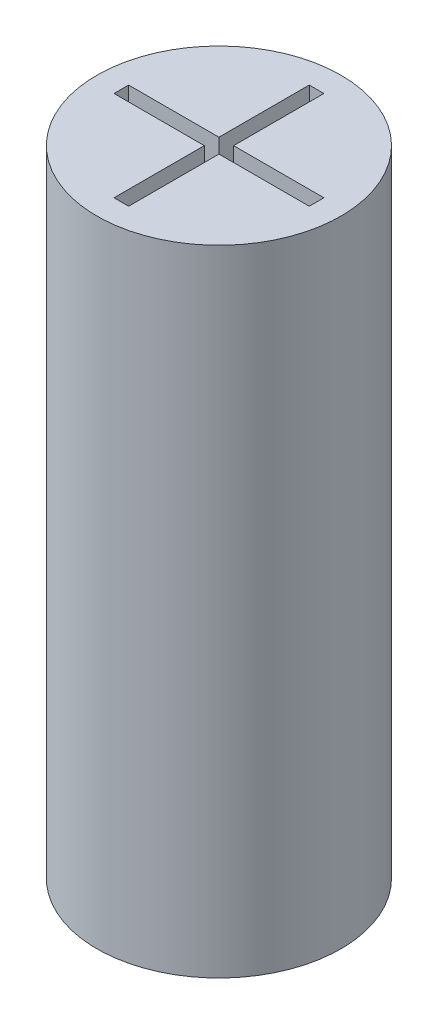
ISO-10303-21;
HEADER;
FILE_DESCRIPTION(('STEP AP214'),'2;1');
FILE_NAME('part.step','',(''),(''),'','','');
FILE_SCHEMA(('AUTOMOTIVE_DESIGN { 1 0 10303 214 1 1 1 1 }'));
ENDSEC;
DATA;
#1=APPLICATION_CONTEXT('core data for automotive mechanical design processes');
#2=APPLICATION_PROTOCOL_DEFINITION('international standard','automotive_design',2000,#1);
#3=PRODUCT_CONTEXT('',#1,'mechanical');
#4=PRODUCT('Part','Part','',(#3));
#5=PRODUCT_RELATED_PRODUCT_CATEGORY('part','',(#4));
#6=PRODUCT_DEFINITION_FORMATION('','',#4);
#7=PRODUCT_DEFINITION_CONTEXT('part definition',#1,'design');
#8=PRODUCT_DEFINITION('design','',#6,#7);
#9=PRODUCT_DEFINITION_SHAPE('','',#8);
#10=(LENGTH_UNIT() NAMED_UNIT(*) SI_UNIT(.MILLI.,.METRE.));
#11=(NAMED_UNIT(*) PLANE_ANGLE_UNIT() SI_UNIT($,.RADIAN.));
#12=(NAMED_UNIT(*) SI_UNIT($,.STERADIAN.) SOLID_ANGLE_UNIT());
#13=UNCERTAINTY_MEASURE_WITH_UNIT(LENGTH_MEASURE(1.E-05),#10,'distance_accuracy_value','');
#14=(GEOMETRIC_REPRESENTATION_CONTEXT(3) GLOBAL_UNCERTAINTY_ASSIGNED_CONTEXT((#13)) GLOBAL_UNIT_ASSIGNED_CONTEXT((#10,
#11,#12)) REPRESENTATION_CONTEXT('',''));
#15=CARTESIAN_POINT('',(0.,0.,0.));
#16=DIRECTION('',(0.,0.,1.));
#17=DIRECTION('',(1.,0.,0.));
#18=AXIS2_PLACEMENT_3D('',#15,#16,#17);
#19=CARTESIAN_POINT('',(0.,13.,0.));
#20=DIRECTION('',(0.,1.,0.));
#21=DIRECTION('',(0.,0.,1.));
#22=AXIS2_PLACEMENT_3D('',#19,#20,#21);
#23=PLANE('',#22);
#24=CARTESIAN_POINT('',(0.,13.,0.));
#25=DIRECTION('',(0.,1.,0.));
#26=DIRECTION('',(0.,0.,1.));
#27=AXIS2_PLACEMENT_3D('',#24,#25,#26);
#28=CIRCLE('',#27,2.5);
#29=CARTESIAN_POINT('',(0.,13.,-2.5));
#30=VERTEX_POINT('',#29);
#31=EDGE_CURVE('E11',#30,#30,#28,.T.);
#32=ORIENTED_EDGE('',*,*,#31,.T.);
#33=EDGE_LOOP('',(#32));
#34=FACE_BOUND('',#33,.T.);
#35=DIRECTION('',(1.,0.,0.));
#36=VECTOR('',#35,1.);
#37=CARTESIAN_POINT('',(0.,13.,-0.149999999999999));
#38=LINE('',#37,#36);
#39=CARTESIAN_POINT('',(0.15,13.,-0.149999999999999));
#40=VERTEX_POINT('',#39);
#41=CARTESIAN_POINT('',(2.,13.,-0.149999999999999));
#42=VERTEX_POINT('',#41);
#43=EDGE_CURVE('E181',#40,#42,#38,.T.);
#44=ORIENTED_EDGE('',*,*,#43,.T.);
#45=DIRECTION('',(0.,0.,1.));
#46=VECTOR('',#45,1.);
#47=CARTESIAN_POINT('',(2.,13.,0.));
#48=LINE('',#47,#46);
#49=CARTESIAN_POINT('',(2.,13.,0.150000000000001));
#50=VERTEX_POINT('',#49);
#51=EDGE_CURVE('E61',#42,#50,#48,.T.);
#52=ORIENTED_EDGE('',*,*,#51,.T.);
#53=DIRECTION('',(1.,0.,0.));
#54=VECTOR('',#53,1.);
#55=CARTESIAN_POINT('',(0.,13.,0.150000000000001));
#56=LINE('',#55,#54);
#57=CARTESIAN_POINT('',(0.15,13.,0.150000000000001));
#58=VERTEX_POINT('',#57);
#59=EDGE_CURVE('E218',#58,#50,#56,.T.);
#60=ORIENTED_EDGE('',*,*,#59,.F.);
#61=DIRECTION('',(0.,0.,1.));
#62=VECTOR('',#61,1.);
#63=CARTESIAN_POINT('',(0.15,13.,0.));
#64=LINE('',#63,#62);
#65=CARTESIAN_POINT('',(0.15,13.,2.));
#66=VERTEX_POINT('',#65);
#67=EDGE_CURVE('E215',#58,#66,#64,.T.);
#68=ORIENTED_EDGE('',*,*,#67,.T.);
#69=DIRECTION('',(-1.,0.,0.));
#70=VECTOR('',#69,1.);
#71=CARTESIAN_POINT('',(0.,13.,2.));
#72=LINE('',#71,#70);
#73=CARTESIAN_POINT('',(-0.15,13.,2.));
#74=VERTEX_POINT('',#73);
#75=EDGE_CURVE('E159',#66,#74,#72,.T.);
#76=ORIENTED_EDGE('',*,*,#75,.T.);
#77=DIRECTION('',(0.,0.,1.));
#78=VECTOR('',#77,1.);
#79=CARTESIAN_POINT('',(-0.15,13.,0.));
#80=LINE('',#79,#78);
#81=CARTESIAN_POINT('',(-0.15,13.,0.150000000000001));
#82=VERTEX_POINT('',#81);
#83=EDGE_CURVE('E209',#82,#74,#80,.T.);
#84=ORIENTED_EDGE('',*,*,#83,.F.);
#85=DIRECTION('',(1.,0.,0.));
#86=VECTOR('',#85,1.);
#87=CARTESIAN_POINT('',(0.,13.,0.150000000000001));
#88=LINE('',#87,#86);
#89=CARTESIAN_POINT('',(-2.,13.,0.150000000000001));
#90=VERTEX_POINT('',#89);
#91=EDGE_CURVE('E205',#90,#82,#88,.T.);
#92=ORIENTED_EDGE('',*,*,#91,.F.);
#93=DIRECTION('',(0.,0.,1.));
#94=VECTOR('',#93,1.);
#95=CARTESIAN_POINT('',(-2.,13.,0.));
#96=LINE('',#95,#94);
#97=CARTESIAN_POINT('',(-2.,13.,-0.149999999999999));
#98=VERTEX_POINT('',#97);
#99=EDGE_CURVE('E201',#98,#90,#96,.T.);
#100=ORIENTED_EDGE('',*,*,#99,.F.);
#101=DIRECTION('',(1.,0.,0.));
#102=VECTOR('',#101,1.);
#103=CARTESIAN_POINT('',(0.,13.,-0.149999999999999));
#104=LINE('',#103,#102);
#105=CARTESIAN_POINT('',(-0.15,13.,-0.149999999999999));
#106=VERTEX_POINT('',#105);
#107=EDGE_CURVE('E197',#98,#106,#104,.T.);
#108=ORIENTED_EDGE('',*,*,#107,.T.);
#109=DIRECTION('',(0.,0.,1.));
#110=VECTOR('',#109,1.);
#111=CARTESIAN_POINT('',(-0.15,13.,0.));
#112=LINE('',#111,#110);
#113=CARTESIAN_POINT('',(-0.15,13.,-2.));
#114=VERTEX_POINT('',#113);
#115=EDGE_CURVE('E193',#114,#106,#112,.T.);
#116=ORIENTED_EDGE('',*,*,#115,.F.);
#117=DIRECTION('',(-1.,0.,0.));
#118=VECTOR('',#117,1.);
#119=CARTESIAN_POINT('',(0.,13.,-2.));
#120=LINE('',#119,#118);
#121=CARTESIAN_POINT('',(0.15,13.,-2.));
#122=VERTEX_POINT('',#121);
#123=EDGE_CURVE('E189',#122,#114,#120,.T.);
#124=ORIENTED_EDGE('',*,*,#123,.F.);
#125=DIRECTION('',(0.,0.,1.));
#126=VECTOR('',#125,1.);
#127=CARTESIAN_POINT('',(0.15,13.,0.));
#128=LINE('',#127,#126);
#129=EDGE_CURVE('E185',#122,#40,#128,.T.);
#130=ORIENTED_EDGE('',*,*,#129,.T.);
#131=EDGE_LOOP('',(#44,#52,#60,#68,#76,#84,#92,#100,#108,#116,#124,#130));
#132=FACE_BOUND('',#131,.T.);
#133=ADVANCED_FACE('F45',(#34,#132),#23,.T.);
#134=CARTESIAN_POINT('',(0.,13.,0.));
#135=DIRECTION('',(0.,-1.,0.));
#136=DIRECTION('',(0.,0.,-1.));
#137=AXIS2_PLACEMENT_3D('',#134,#135,#136);
#138=CYLINDRICAL_SURFACE('',#137,2.5);
#139=CARTESIAN_POINT('',(0.,0.,0.));
#140=DIRECTION('',(0.,1.,0.));
#141=DIRECTION('',(0.,0.,1.));
#142=AXIS2_PLACEMENT_3D('',#139,#140,#141);
#143=CIRCLE('',#142,2.5);
#144=CARTESIAN_POINT('',(0.,0.,-2.5));
#145=VERTEX_POINT('',#144);
#146=EDGE_CURVE('E49',#145,#145,#143,.T.);
#147=CARTESIAN_POINT('',(0.,13.,-2.5));
#148=CARTESIAN_POINT('',(0.,12.8645833333333,-2.5));
#149=CARTESIAN_POINT('',(0.,12.7291666666667,-2.5));
#150=CARTESIAN_POINT('',(0.,12.4583333333333,-2.5));
#151=CARTESIAN_POINT('',(0.,12.3229166666667,-2.5));
#152=CARTESIAN_POINT('',(0.,12.0520833333333,-2.5));
#153=CARTESIAN_POINT('',(0.,11.9166666666667,-2.5));
#154=CARTESIAN_POINT('',(0.,11.6458333333333,-2.5));
#155=CARTESIAN_POINT('',(0.,11.5104166666667,-2.5));
#156=CARTESIAN_POINT('',(0.,11.2395833333333,-2.5));
#157=CARTESIAN_POINT('',(0.,11.1041666666667,-2.5));
#158=CARTESIAN_POINT('',(0.,10.8333333333333,-2.5));
#159=CARTESIAN_POINT('',(0.,10.6979166666667,-2.5));
#160=CARTESIAN_POINT('',(0.,10.4270833333333,-2.5));
#161=CARTESIAN_POINT('',(0.,10.2916666666667,-2.5));
#162=CARTESIAN_POINT('',(0.,10.0208333333333,-2.5));
#163=CARTESIAN_POINT('',(0.,9.88541666666667,-2.5));
#164=CARTESIAN_POINT('',(0.,9.61458333333333,-2.5));
#165=CARTESIAN_POINT('',(0.,9.47916666666667,-2.5));
#166=CARTESIAN_POINT('',(0.,9.20833333333333,-2.5));
#167=CARTESIAN_POINT('',(0.,9.07291666666667,-2.5));
#168=CARTESIAN_POINT('',(0.,8.80208333333333,-2.5));
#169=CARTESIAN_POINT('',(0.,8.66666666666667,-2.5));
#170=CARTESIAN_POINT('',(0.,8.39583333333333,-2.5));
#171=CARTESIAN_POINT('',(0.,8.26041666666667,-2.5));
#172=CARTESIAN_POINT('',(0.,7.98958333333333,-2.5));
#173=CARTESIAN_POINT('',(0.,7.85416666666667,-2.5));
#174=CARTESIAN_POINT('',(0.,7.58333333333333,-2.5));
#175=CARTESIAN_POINT('',(0.,7.44791666666667,-2.5));
#176=CARTESIAN_POINT('',(0.,7.17708333333333,-2.5));
#177=CARTESIAN_POINT('',(0.,7.04166666666667,-2.5));
#178=CARTESIAN_POINT('',(0.,6.77083333333333,-2.5));
#179=CARTESIAN_POINT('',(0.,6.63541666666667,-2.5));
#180=CARTESIAN_POINT('',(0.,6.36458333333333,-2.5));
#181=CARTESIAN_POINT('',(0.,6.22916666666667,-2.5));
#182=CARTESIAN_POINT('',(0.,5.95833333333333,-2.5));
#183=CARTESIAN_POINT('',(0.,5.82291666666667,-2.5));
#184=CARTESIAN_POINT('',(0.,5.55208333333333,-2.5));
#185=CARTESIAN_POINT('',(0.,5.41666666666667,-2.5));
#186=CARTESIAN_POINT('',(0.,5.14583333333333,-2.5));
#187=CARTESIAN_POINT('',(0.,5.01041666666667,-2.5));
#188=CARTESIAN_POINT('',(0.,4.73958333333333,-2.5));
#189=CARTESIAN_POINT('',(0.,4.60416666666667,-2.5));
#190=CARTESIAN_POINT('',(0.,4.33333333333333,-2.5));
#191=CARTESIAN_POINT('',(0.,4.19791666666667,-2.5));
#192=CARTESIAN_POINT('',(0.,3.92708333333333,-2.5));
#193=CARTESIAN_POINT('',(0.,3.79166666666667,-2.5));
#194=CARTESIAN_POINT('',(0.,3.52083333333333,-2.5));
#195=CARTESIAN_POINT('',(0.,3.38541666666667,-2.5));
#196=CARTESIAN_POINT('',(0.,3.11458333333333,-2.5));
#197=CARTESIAN_POINT('',(0.,2.97916666666667,-2.5));
#198=CARTESIAN_POINT('',(0.,2.70833333333333,-2.5));
#199=CARTESIAN_POINT('',(0.,2.57291666666667,-2.5));
#200=CARTESIAN_POINT('',(0.,2.30208333333333,-2.5));
#201=CARTESIAN_POINT('',(0.,2.16666666666667,-2.5));
#202=CARTESIAN_POINT('',(0.,1.89583333333333,-2.5));
#203=CARTESIAN_POINT('',(0.,1.76041666666667,-2.5));
#204=CARTESIAN_POINT('',(0.,1.48958333333333,-2.5));
#205=CARTESIAN_POINT('',(0.,1.35416666666667,-2.5));
#206=CARTESIAN_POINT('',(0.,1.08333333333333,-2.5));
#207=CARTESIAN_POINT('',(0.,0.947916666666667,-2.5));
#208=CARTESIAN_POINT('',(0.,0.677083333333334,-2.5));
#209=CARTESIAN_POINT('',(0.,0.541666666666667,-2.5));
#210=CARTESIAN_POINT('',(0.,0.270833333333334,-2.5));
#211=CARTESIAN_POINT('',(0.,0.135416666666667,-2.5));
#212=CARTESIAN_POINT('',(0.,0.,-2.5));
#213=B_SPLINE_CURVE_WITH_KNOTS('',3,(#147,#148,#149,#150,#151,#152,#153,#154,#155,#156,#157,
#158,#159,#160,#161,#162,#163,#164,#165,#166,#167,#168,#169,#170,#171,#172,#173,#174,#175,#176,
#177,#178,#179,#180,#181,#182,#183,#184,#185,#186,#187,#188,#189,#190,#191,#192,#193,#194,#195,
#196,#197,#198,#199,#200,#201,#202,#203,#204,#205,#206,#207,#208,#209,#210,#211,#212),
.UNSPECIFIED.,.F.,.F.,(4,2,2,2,2,2,2,2,2,2,2,2,2,2,2,2,2,2,2,2,2,2,2,2,2,2,2,2,2,2,2,2,4),(0.,
0.406249999999999,0.812499999999999,1.21875,1.625,2.03125,2.4375,2.84375,3.25,3.65625,4.0625,
4.46875,4.875,5.28125,5.6875,6.09375,6.5,6.90625,7.3125,7.71875,8.125,8.53125,8.9375,9.34375,
9.75,10.15625,10.5625,10.96875,11.375,11.78125,12.1875,12.59375,13.),.UNSPECIFIED.);
#214=EDGE_CURVE('BSEAM47',#30,#145,#213,.T.);
#215=ORIENTED_EDGE('',*,*,#31,.F.);
#216=ORIENTED_EDGE('',*,*,#146,.T.);
#217=ORIENTED_EDGE('',*,*,#214,.T.);
#218=ORIENTED_EDGE('',*,*,#214,.F.);
#219=EDGE_LOOP('',(#215,#217,#216,#218));
#220=FACE_BOUND('',#219,.T.);
#221=ADVANCED_FACE('F47',(#220),#138,.T.);
#222=CARTESIAN_POINT('',(0.,0.,0.));
#223=DIRECTION('',(0.,1.,0.));
#224=DIRECTION('',(0.,0.,1.));
#225=AXIS2_PLACEMENT_3D('',#222,#223,#224);
#226=PLANE('',#225);
#227=ORIENTED_EDGE('',*,*,#146,.F.);
#228=EDGE_LOOP('',(#227));
#229=FACE_BOUND('',#228,.T.);
#230=ADVANCED_FACE('F302',(#229),#226,.F.);
#231=CARTESIAN_POINT('',(2.,12.,0.));
#232=DIRECTION('',(-1.,0.,0.));
#233=DIRECTION('',(0.,0.,1.));
#234=AXIS2_PLACEMENT_3D('',#231,#232,#233);
#235=PLANE('',#234);
#236=ORIENTED_EDGE('',*,*,#51,.F.);
#237=DIRECTION('',(0.,1.,0.));
#238=VECTOR('',#237,1.);
#239=CARTESIAN_POINT('',(2.,12.,-0.149999999999999));
#240=LINE('',#239,#238);
#241=CARTESIAN_POINT('',(2.,12.,-0.149999999999999));
#242=VERTEX_POINT('',#241);
#243=EDGE_CURVE('E178',#242,#42,#240,.T.);
#244=ORIENTED_EDGE('',*,*,#243,.F.);
#245=DIRECTION('',(0.,0.,1.));
#246=VECTOR('',#245,1.);
#247=CARTESIAN_POINT('',(2.,12.,0.));
#248=LINE('',#247,#246);
#249=CARTESIAN_POINT('',(2.,12.,0.150000000000001));
#250=VERTEX_POINT('',#249);
#251=EDGE_CURVE('E67',#242,#250,#248,.T.);
#252=ORIENTED_EDGE('',*,*,#251,.T.);
#253=DIRECTION('',(0.,1.,0.));
#254=VECTOR('',#253,1.);
#255=CARTESIAN_POINT('',(2.,12.,0.150000000000001));
#256=LINE('',#255,#254);
#257=EDGE_CURVE('E105',#250,#50,#256,.T.);
#258=ORIENTED_EDGE('',*,*,#257,.T.);
#259=EDGE_LOOP('',(#236,#244,#252,#258));
#260=FACE_BOUND('',#259,.T.);
#261=ADVANCED_FACE('F295',(#260),#235,.T.);
#262=CARTESIAN_POINT('',(0.,12.,0.150000000000001));
#263=DIRECTION('',(0.,0.,1.));
#264=DIRECTION('',(1.,0.,0.));
#265=AXIS2_PLACEMENT_3D('',#262,#263,#264);
#266=PLANE('',#265);
#267=ORIENTED_EDGE('',*,*,#59,.T.);
#268=ORIENTED_EDGE('',*,*,#257,.F.);
#269=DIRECTION('',(1.,0.,0.));
#270=VECTOR('',#269,1.);
#271=CARTESIAN_POINT('',(0.,12.,0.150000000000001));
#272=LINE('',#271,#270);
#273=CARTESIAN_POINT('',(0.15,12.,0.150000000000001));
#274=VERTEX_POINT('',#273);
#275=EDGE_CURVE('E152',#274,#250,#272,.T.);
#276=ORIENTED_EDGE('',*,*,#275,.F.);
#277=DIRECTION('',(0.,1.,0.));
#278=VECTOR('',#277,1.);
#279=CARTESIAN_POINT('',(0.15,12.,0.150000000000001));
#280=LINE('',#279,#278);
#281=EDGE_CURVE('E146',#274,#58,#280,.T.);
#282=ORIENTED_EDGE('',*,*,#281,.T.);
#283=EDGE_LOOP('',(#267,#268,#276,#282));
#284=FACE_BOUND('',#283,.T.);
#285=ADVANCED_FACE('F293',(#284),#266,.F.);
#286=CARTESIAN_POINT('',(0.15,12.,0.));
#287=DIRECTION('',(-1.,0.,0.));
#288=DIRECTION('',(0.,0.,1.));
#289=AXIS2_PLACEMENT_3D('',#286,#287,#288);
#290=PLANE('',#289);
#291=ORIENTED_EDGE('',*,*,#67,.F.);
#292=ORIENTED_EDGE('',*,*,#281,.F.);
#293=DIRECTION('',(0.,0.,1.));
#294=VECTOR('',#293,1.);
#295=CARTESIAN_POINT('',(0.15,12.,0.));
#296=LINE('',#295,#294);
#297=CARTESIAN_POINT('',(0.15,12.,2.));
#298=VERTEX_POINT('',#297);
#299=EDGE_CURVE('E140',#274,#298,#296,.T.);
#300=ORIENTED_EDGE('',*,*,#299,.T.);
#301=DIRECTION('',(0.,1.,0.));
#302=VECTOR('',#301,1.);
#303=CARTESIAN_POINT('',(0.15,12.,2.));
#304=LINE('',#303,#302);
#305=EDGE_CURVE('E144',#298,#66,#304,.T.);
#306=ORIENTED_EDGE('',*,*,#305,.T.);
#307=EDGE_LOOP('',(#291,#292,#300,#306));
#308=FACE_BOUND('',#307,.T.);
#309=ADVANCED_FACE('F143',(#308),#290,.T.);
#310=CARTESIAN_POINT('',(0.,12.,2.));
#311=DIRECTION('',(0.,0.,-1.));
#312=DIRECTION('',(-1.,0.,0.));
#313=AXIS2_PLACEMENT_3D('',#310,#311,#312);
#314=PLANE('',#313);
#315=ORIENTED_EDGE('',*,*,#75,.F.);
#316=ORIENTED_EDGE('',*,*,#305,.F.);
#317=DIRECTION('',(-1.,0.,0.));
#318=VECTOR('',#317,1.);
#319=CARTESIAN_POINT('',(0.,12.,2.));
#320=LINE('',#319,#318);
#321=CARTESIAN_POINT('',(-0.15,12.,2.));
#322=VERTEX_POINT('',#321);
#323=EDGE_CURVE('E153',#298,#322,#320,.T.);
#324=ORIENTED_EDGE('',*,*,#323,.T.);
#325=DIRECTION('',(0.,1.,0.));
#326=VECTOR('',#325,1.);
#327=CARTESIAN_POINT('',(-0.15,12.,2.));
#328=LINE('',#327,#326);
#329=EDGE_CURVE('E162',#322,#74,#328,.T.);
#330=ORIENTED_EDGE('',*,*,#329,.T.);
#331=EDGE_LOOP('',(#315,#316,#324,#330));
#332=FACE_BOUND('',#331,.T.);
#333=ADVANCED_FACE('F156',(#332),#314,.T.);
#334=CARTESIAN_POINT('',(-0.15,12.,0.));
#335=DIRECTION('',(-1.,0.,0.));
#336=DIRECTION('',(0.,0.,1.));
#337=AXIS2_PLACEMENT_3D('',#334,#335,#336);
#338=PLANE('',#337);
#339=ORIENTED_EDGE('',*,*,#83,.T.);
#340=ORIENTED_EDGE('',*,*,#329,.F.);
#341=DIRECTION('',(0.,0.,1.));
#342=VECTOR('',#341,1.);
#343=CARTESIAN_POINT('',(-0.15,12.,0.));
#344=LINE('',#343,#342);
#345=CARTESIAN_POINT('',(-0.15,12.,0.150000000000001));
#346=VERTEX_POINT('',#345);
#347=EDGE_CURVE('E168',#346,#322,#344,.T.);
#348=ORIENTED_EDGE('',*,*,#347,.F.);
#349=DIRECTION('',(0.,1.,0.));
#350=VECTOR('',#349,1.);
#351=CARTESIAN_POINT('',(-0.15,12.,0.150000000000001));
#352=LINE('',#351,#350);
#353=EDGE_CURVE('E227',#346,#82,#352,.T.);
#354=ORIENTED_EDGE('',*,*,#353,.T.);
#355=EDGE_LOOP('',(#339,#340,#348,#354));
#356=FACE_BOUND('',#355,.T.);
#357=ADVANCED_FACE('F291',(#356),#338,.F.);
#358=CARTESIAN_POINT('',(0.,12.,0.150000000000001));
#359=DIRECTION('',(0.,0.,1.));
#360=DIRECTION('',(1.,0.,0.));
#361=AXIS2_PLACEMENT_3D('',#358,#359,#360);
#362=PLANE('',#361);
#363=ORIENTED_EDGE('',*,*,#91,.T.);
#364=ORIENTED_EDGE('',*,*,#353,.F.);
#365=DIRECTION('',(1.,0.,0.));
#366=VECTOR('',#365,1.);
#367=CARTESIAN_POINT('',(0.,12.,0.150000000000001));
#368=LINE('',#367,#366);
#369=CARTESIAN_POINT('',(-2.,12.,0.150000000000001));
#370=VERTEX_POINT('',#369);
#371=EDGE_CURVE('E172',#370,#346,#368,.T.);
#372=ORIENTED_EDGE('',*,*,#371,.F.);
#373=DIRECTION('',(0.,1.,0.));
#374=VECTOR('',#373,1.);
#375=CARTESIAN_POINT('',(-2.,12.,0.150000000000001));
#376=LINE('',#375,#374);
#377=EDGE_CURVE('E230',#370,#90,#376,.T.);
#378=ORIENTED_EDGE('',*,*,#377,.T.);
#379=EDGE_LOOP('',(#363,#364,#372,#378));
#380=FACE_BOUND('',#379,.T.);
#381=ADVANCED_FACE('F287',(#380),#362,.F.);
#382=CARTESIAN_POINT('',(-2.,12.,0.));
#383=DIRECTION('',(-1.,0.,0.));
#384=DIRECTION('',(0.,0.,1.));
#385=AXIS2_PLACEMENT_3D('',#382,#383,#384);
#386=PLANE('',#385);
#387=ORIENTED_EDGE('',*,*,#99,.T.);
#388=ORIENTED_EDGE('',*,*,#377,.F.);
#389=DIRECTION('',(0.,0.,1.));
#390=VECTOR('',#389,1.);
#391=CARTESIAN_POINT('',(-2.,12.,0.));
#392=LINE('',#391,#390);
#393=CARTESIAN_POINT('',(-2.,12.,-0.149999999999999));
#394=VERTEX_POINT('',#393);
#395=EDGE_CURVE('E279',#394,#370,#392,.T.);
#396=ORIENTED_EDGE('',*,*,#395,.F.);
#397=DIRECTION('',(0.,1.,0.));
#398=VECTOR('',#397,1.);
#399=CARTESIAN_POINT('',(-2.,12.,-0.149999999999999));
#400=LINE('',#399,#398);
#401=EDGE_CURVE('E233',#394,#98,#400,.T.);
#402=ORIENTED_EDGE('',*,*,#401,.T.);
#403=EDGE_LOOP('',(#387,#388,#396,#402));
#404=FACE_BOUND('',#403,.T.);
#405=ADVANCED_FACE('F368',(#404),#386,.F.);
#406=CARTESIAN_POINT('',(0.,12.,-0.149999999999999));
#407=DIRECTION('',(0.,0.,1.));
#408=DIRECTION('',(1.,0.,0.));
#409=AXIS2_PLACEMENT_3D('',#406,#407,#408);
#410=PLANE('',#409);
#411=ORIENTED_EDGE('',*,*,#107,.F.);
#412=ORIENTED_EDGE('',*,*,#401,.F.);
#413=DIRECTION('',(1.,0.,0.));
#414=VECTOR('',#413,1.);
#415=CARTESIAN_POINT('',(0.,12.,-0.149999999999999));
#416=LINE('',#415,#414);
#417=CARTESIAN_POINT('',(-0.15,12.,-0.149999999999999));
#418=VERTEX_POINT('',#417);
#419=EDGE_CURVE('E276',#394,#418,#416,.T.);
#420=ORIENTED_EDGE('',*,*,#419,.T.);
#421=DIRECTION('',(0.,1.,0.));
#422=VECTOR('',#421,1.);
#423=CARTESIAN_POINT('',(-0.15,12.,-0.149999999999999));
#424=LINE('',#423,#422);
#425=EDGE_CURVE('E236',#418,#106,#424,.T.);
#426=ORIENTED_EDGE('',*,*,#425,.T.);
#427=EDGE_LOOP('',(#411,#412,#420,#426));
#428=FACE_BOUND('',#427,.T.);
#429=ADVANCED_FACE('F376',(#428),#410,.T.);
#430=CARTESIAN_POINT('',(-0.15,12.,0.));
#431=DIRECTION('',(-1.,0.,0.));
#432=DIRECTION('',(0.,0.,1.));
#433=AXIS2_PLACEMENT_3D('',#430,#431,#432);
#434=PLANE('',#433);
#435=ORIENTED_EDGE('',*,*,#115,.T.);
#436=ORIENTED_EDGE('',*,*,#425,.F.);
#437=DIRECTION('',(0.,0.,1.));
#438=VECTOR('',#437,1.);
#439=CARTESIAN_POINT('',(-0.15,12.,0.));
#440=LINE('',#439,#438);
#441=CARTESIAN_POINT('',(-0.15,12.,-2.));
#442=VERTEX_POINT('',#441);
#443=EDGE_CURVE('E272',#442,#418,#440,.T.);
#444=ORIENTED_EDGE('',*,*,#443,.F.);
#445=DIRECTION('',(0.,1.,0.));
#446=VECTOR('',#445,1.);
#447=CARTESIAN_POINT('',(-0.15,12.,-2.));
#448=LINE('',#447,#446);
#449=EDGE_CURVE('E239',#442,#114,#448,.T.);
#450=ORIENTED_EDGE('',*,*,#449,.T.);
#451=EDGE_LOOP('',(#435,#436,#444,#450));
#452=FACE_BOUND('',#451,.T.);
#453=ADVANCED_FACE('F385',(#452),#434,.F.);
#454=CARTESIAN_POINT('',(0.,12.,-2.));
#455=DIRECTION('',(0.,0.,-1.));
#456=DIRECTION('',(-1.,0.,0.));
#457=AXIS2_PLACEMENT_3D('',#454,#455,#456);
#458=PLANE('',#457);
#459=ORIENTED_EDGE('',*,*,#123,.T.);
#460=ORIENTED_EDGE('',*,*,#449,.F.);
#461=DIRECTION('',(-1.,0.,0.));
#462=VECTOR('',#461,1.);
#463=CARTESIAN_POINT('',(0.,12.,-2.));
#464=LINE('',#463,#462);
#465=CARTESIAN_POINT('',(0.15,12.,-2.));
#466=VERTEX_POINT('',#465);
#467=EDGE_CURVE('E266',#466,#442,#464,.T.);
#468=ORIENTED_EDGE('',*,*,#467,.F.);
#469=DIRECTION('',(0.,1.,0.));
#470=VECTOR('',#469,1.);
#471=CARTESIAN_POINT('',(0.15,12.,-2.));
#472=LINE('',#471,#470);
#473=EDGE_CURVE('E242',#466,#122,#472,.T.);
#474=ORIENTED_EDGE('',*,*,#473,.T.);
#475=EDGE_LOOP('',(#459,#460,#468,#474));
#476=FACE_BOUND('',#475,.T.);
#477=ADVANCED_FACE('F394',(#476),#458,.F.);
#478=CARTESIAN_POINT('',(0.15,12.,0.));
#479=DIRECTION('',(-1.,0.,0.));
#480=DIRECTION('',(0.,0.,1.));
#481=AXIS2_PLACEMENT_3D('',#478,#479,#480);
#482=PLANE('',#481);
#483=ORIENTED_EDGE('',*,*,#129,.F.);
#484=ORIENTED_EDGE('',*,*,#473,.F.);
#485=DIRECTION('',(0.,0.,1.));
#486=VECTOR('',#485,1.);
#487=CARTESIAN_POINT('',(0.15,12.,0.));
#488=LINE('',#487,#486);
#489=CARTESIAN_POINT('',(0.15,12.,-0.149999999999999));
#490=VERTEX_POINT('',#489);
#491=EDGE_CURVE('E259',#466,#490,#488,.T.);
#492=ORIENTED_EDGE('',*,*,#491,.T.);
#493=DIRECTION('',(0.,1.,0.));
#494=VECTOR('',#493,1.);
#495=CARTESIAN_POINT('',(0.15,12.,-0.149999999999999));
#496=LINE('',#495,#494);
#497=EDGE_CURVE('E245',#490,#40,#496,.T.);
#498=ORIENTED_EDGE('',*,*,#497,.T.);
#499=EDGE_LOOP('',(#483,#484,#492,#498));
#500=FACE_BOUND('',#499,.T.);
#501=ADVANCED_FACE('F257',(#500),#482,.T.);
#502=CARTESIAN_POINT('',(0.,12.,-0.149999999999999));
#503=DIRECTION('',(0.,0.,1.));
#504=DIRECTION('',(1.,0.,0.));
#505=AXIS2_PLACEMENT_3D('',#502,#503,#504);
#506=PLANE('',#505);
#507=ORIENTED_EDGE('',*,*,#43,.F.);
#508=ORIENTED_EDGE('',*,*,#497,.F.);
#509=DIRECTION('',(1.,0.,0.));
#510=VECTOR('',#509,1.);
#511=CARTESIAN_POINT('',(0.,12.,-0.149999999999999));
#512=LINE('',#511,#510);
#513=EDGE_CURVE('E113',#490,#242,#512,.T.);
#514=ORIENTED_EDGE('',*,*,#513,.T.);
#515=ORIENTED_EDGE('',*,*,#243,.T.);
#516=EDGE_LOOP('',(#507,#508,#514,#515));
#517=FACE_BOUND('',#516,.T.);
#518=ADVANCED_FACE('F250',(#517),#506,.T.);
#519=CARTESIAN_POINT('',(0.,12.,0.));
#520=DIRECTION('',(0.,1.,0.));
#521=DIRECTION('',(0.,0.,1.));
#522=AXIS2_PLACEMENT_3D('',#519,#520,#521);
#523=PLANE('',#522);
#524=ORIENTED_EDGE('',*,*,#251,.F.);
#525=ORIENTED_EDGE('',*,*,#513,.F.);
#526=ORIENTED_EDGE('',*,*,#491,.F.);
#527=ORIENTED_EDGE('',*,*,#467,.T.);
#528=ORIENTED_EDGE('',*,*,#443,.T.);
#529=ORIENTED_EDGE('',*,*,#419,.F.);
#530=ORIENTED_EDGE('',*,*,#395,.T.);
#531=ORIENTED_EDGE('',*,*,#371,.T.);
#532=ORIENTED_EDGE('',*,*,#347,.T.);
#533=ORIENTED_EDGE('',*,*,#323,.F.);
#534=ORIENTED_EDGE('',*,*,#299,.F.);
#535=ORIENTED_EDGE('',*,*,#275,.T.);
#536=EDGE_LOOP('',(#524,#525,#526,#527,#528,#529,#530,#531,#532,#533,#534,#535));
#537=FACE_BOUND('',#536,.T.);
#538=ADVANCED_FACE('F165',(#537),#523,.T.);
#539=CLOSED_SHELL('',(#133,#221,#230,#261,#285,#309,#333,#357,#381,#405,#429,#453,#477,#501,
#518,#538));
#540=MANIFOLD_SOLID_BREP('B2',#539);
#541=ADVANCED_BREP_SHAPE_REPRESENTATION('',(#18,#540),#14);
#542=SHAPE_DEFINITION_REPRESENTATION(#9,#541);
ENDSEC;
END-ISO-10303-21;
